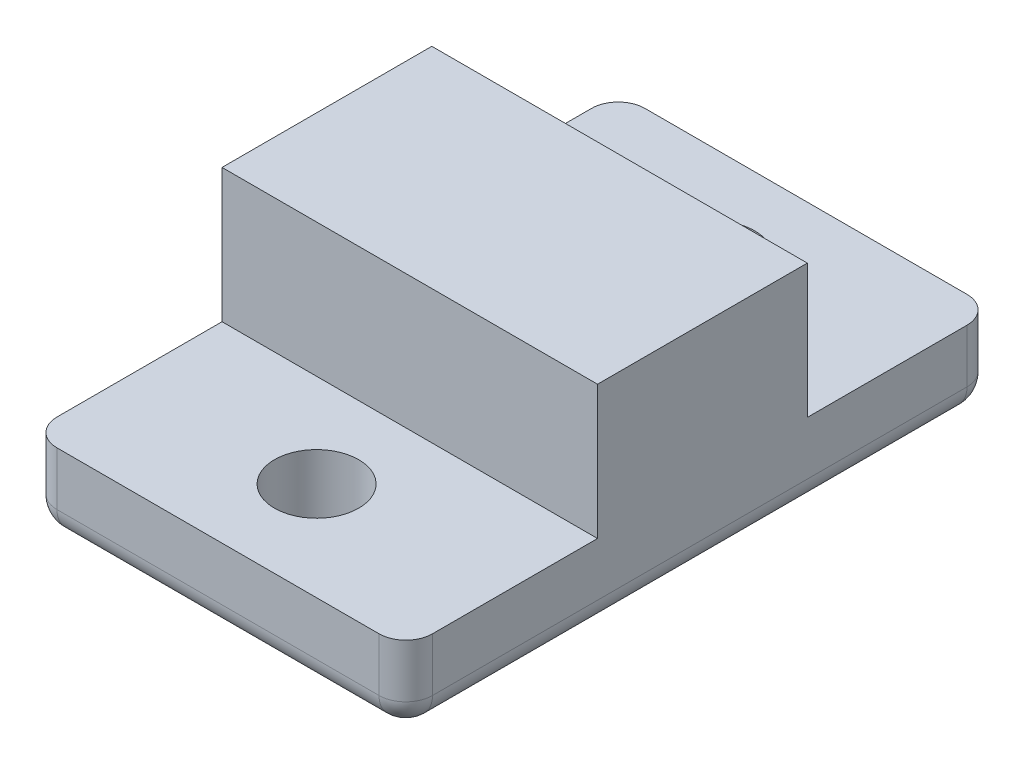
ISO-10303-21;
HEADER;
FILE_DESCRIPTION(('STEP AP214'),'2;1');
FILE_NAME('part.step','',(''),(''),'','','');
FILE_SCHEMA(('AUTOMOTIVE_DESIGN { 1 0 10303 214 1 1 1 1 }'));
ENDSEC;
DATA;
#1=APPLICATION_CONTEXT('core data for automotive mechanical design processes');
#2=APPLICATION_PROTOCOL_DEFINITION('international standard','automotive_design',2000,#1);
#3=PRODUCT_CONTEXT('',#1,'mechanical');
#4=PRODUCT('Part','Part','',(#3));
#5=PRODUCT_RELATED_PRODUCT_CATEGORY('part','',(#4));
#6=PRODUCT_DEFINITION_FORMATION('','',#4);
#7=PRODUCT_DEFINITION_CONTEXT('part definition',#1,'design');
#8=PRODUCT_DEFINITION('design','',#6,#7);
#9=PRODUCT_DEFINITION_SHAPE('','',#8);
#10=(LENGTH_UNIT() NAMED_UNIT(*) SI_UNIT(.MILLI.,.METRE.));
#11=(NAMED_UNIT(*) PLANE_ANGLE_UNIT() SI_UNIT($,.RADIAN.));
#12=(NAMED_UNIT(*) SI_UNIT($,.STERADIAN.) SOLID_ANGLE_UNIT());
#13=UNCERTAINTY_MEASURE_WITH_UNIT(LENGTH_MEASURE(1.E-05),#10,'distance_accuracy_value','');
#14=(GEOMETRIC_REPRESENTATION_CONTEXT(3) GLOBAL_UNCERTAINTY_ASSIGNED_CONTEXT((#13)) GLOBAL_UNIT_ASSIGNED_CONTEXT((#10,
#11,#12)) REPRESENTATION_CONTEXT('',''));
#15=CARTESIAN_POINT('',(0.,0.,0.));
#16=DIRECTION('',(0.,0.,1.));
#17=DIRECTION('',(1.,0.,0.));
#18=AXIS2_PLACEMENT_3D('',#15,#16,#17);
#19=CARTESIAN_POINT('',(7.025,5.,-3.925));
#20=DIRECTION('',(-1.,0.,0.));
#21=DIRECTION('',(0.,0.,1.));
#22=AXIS2_PLACEMENT_3D('',#19,#20,#21);
#23=PLANE('',#22);
#24=DIRECTION('',(0.,0.,1.));
#25=VECTOR('',#24,1.);
#26=CARTESIAN_POINT('',(7.025,0.,-3.925));
#27=LINE('',#26,#25);
#28=CARTESIAN_POINT('',(7.025,0.,3.925));
#29=VERTEX_POINT('',#28);
#30=CARTESIAN_POINT('',(7.025,0.,10.1));
#31=VERTEX_POINT('',#30);
#32=EDGE_CURVE('E147',#29,#31,#27,.T.);
#33=ORIENTED_EDGE('',*,*,#32,.T.);
#34=DIRECTION('',(0.,1.,0.));
#35=VECTOR('',#34,1.);
#36=CARTESIAN_POINT('',(7.025,5.,10.1));
#37=LINE('',#36,#35);
#38=CARTESIAN_POINT('',(7.025,-2.,10.1));
#39=VERTEX_POINT('',#38);
#40=EDGE_CURVE('E187',#31,#39,#37,.F.);
#41=ORIENTED_EDGE('',*,*,#40,.T.);
#42=DIRECTION('',(0.,0.,1.));
#43=VECTOR('',#42,1.);
#44=CARTESIAN_POINT('',(7.025,-2.,-10.9));
#45=LINE('',#44,#43);
#46=CARTESIAN_POINT('',(7.025,-2.,-9.9));
#47=VERTEX_POINT('',#46);
#48=EDGE_CURVE('E184',#39,#47,#45,.F.);
#49=ORIENTED_EDGE('',*,*,#48,.T.);
#50=DIRECTION('',(0.,1.,0.));
#51=VECTOR('',#50,1.);
#52=CARTESIAN_POINT('',(7.025,5.,-9.9));
#53=LINE('',#52,#51);
#54=CARTESIAN_POINT('',(7.025,0.,-9.9));
#55=VERTEX_POINT('',#54);
#56=EDGE_CURVE('E143',#47,#55,#53,.T.);
#57=ORIENTED_EDGE('',*,*,#56,.T.);
#58=CARTESIAN_POINT('',(7.025,0.,-3.925));
#59=VERTEX_POINT('',#58);
#60=EDGE_CURVE('E136',#55,#59,#27,.T.);
#61=ORIENTED_EDGE('',*,*,#60,.T.);
#62=DIRECTION('',(0.,-1.,0.));
#63=VECTOR('',#62,1.);
#64=CARTESIAN_POINT('',(7.025,5.,-3.925));
#65=LINE('',#64,#63);
#66=CARTESIAN_POINT('',(7.025,5.,-3.925));
#67=VERTEX_POINT('',#66);
#68=EDGE_CURVE('E141',#67,#59,#65,.T.);
#69=ORIENTED_EDGE('',*,*,#68,.F.);
#70=DIRECTION('',(0.,0.,-1.));
#71=VECTOR('',#70,1.);
#72=CARTESIAN_POINT('',(7.025,5.,-3.925));
#73=LINE('',#72,#71);
#74=CARTESIAN_POINT('',(7.025,5.,3.925));
#75=VERTEX_POINT('',#74);
#76=EDGE_CURVE('E263',#75,#67,#73,.T.);
#77=ORIENTED_EDGE('',*,*,#76,.F.);
#78=DIRECTION('',(0.,-1.,0.));
#79=VECTOR('',#78,1.);
#80=CARTESIAN_POINT('',(7.025,5.,3.925));
#81=LINE('',#80,#79);
#82=EDGE_CURVE('E269',#75,#29,#81,.T.);
#83=ORIENTED_EDGE('',*,*,#82,.T.);
#84=EDGE_LOOP('',(#33,#41,#49,#57,#61,#69,#77,#83));
#85=FACE_BOUND('',#84,.T.);
#86=ADVANCED_FACE('F35',(#85),#23,.F.);
#87=CARTESIAN_POINT('',(-7.025,5.,-3.925));
#88=DIRECTION('',(0.,0.,1.));
#89=DIRECTION('',(1.,0.,0.));
#90=AXIS2_PLACEMENT_3D('',#87,#88,#89);
#91=PLANE('',#90);
#92=DIRECTION('',(-1.,0.,0.));
#93=VECTOR('',#92,1.);
#94=CARTESIAN_POINT('',(-7.025,0.,-3.925));
#95=LINE('',#94,#93);
#96=CARTESIAN_POINT('',(-7.025,0.,-3.925));
#97=VERTEX_POINT('',#96);
#98=EDGE_CURVE('E146',#59,#97,#95,.T.);
#99=ORIENTED_EDGE('',*,*,#98,.T.);
#100=DIRECTION('',(0.,-1.,0.));
#101=VECTOR('',#100,1.);
#102=CARTESIAN_POINT('',(-7.025,5.,-3.925));
#103=LINE('',#102,#101);
#104=CARTESIAN_POINT('',(-7.025,5.,-3.925));
#105=VERTEX_POINT('',#104);
#106=EDGE_CURVE('E162',#105,#97,#103,.T.);
#107=ORIENTED_EDGE('',*,*,#106,.F.);
#108=DIRECTION('',(-1.,0.,0.));
#109=VECTOR('',#108,1.);
#110=CARTESIAN_POINT('',(-7.025,5.,-3.925));
#111=LINE('',#110,#109);
#112=EDGE_CURVE('E159',#67,#105,#111,.T.);
#113=ORIENTED_EDGE('',*,*,#112,.F.);
#114=ORIENTED_EDGE('',*,*,#68,.T.);
#115=EDGE_LOOP('',(#99,#107,#113,#114));
#116=FACE_BOUND('',#115,.T.);
#117=ADVANCED_FACE('F158',(#116),#91,.F.);
#118=CARTESIAN_POINT('',(-7.025,5.,-3.925));
#119=DIRECTION('',(1.,0.,0.));
#120=DIRECTION('',(0.,0.,-1.));
#121=AXIS2_PLACEMENT_3D('',#118,#119,#120);
#122=PLANE('',#121);
#123=DIRECTION('',(0.,0.,-1.));
#124=VECTOR('',#123,1.);
#125=CARTESIAN_POINT('',(-7.025,-2.,11.1));
#126=LINE('',#125,#124);
#127=CARTESIAN_POINT('',(-7.025,-2.,-9.9));
#128=VERTEX_POINT('',#127);
#129=CARTESIAN_POINT('',(-7.025,-2.,10.1));
#130=VERTEX_POINT('',#129);
#131=EDGE_CURVE('E161',#128,#130,#126,.F.);
#132=ORIENTED_EDGE('',*,*,#131,.T.);
#133=DIRECTION('',(0.,1.,0.));
#134=VECTOR('',#133,1.);
#135=CARTESIAN_POINT('',(-7.025,5.,10.1));
#136=LINE('',#135,#134);
#137=CARTESIAN_POINT('',(-7.025,0.,10.1));
#138=VERTEX_POINT('',#137);
#139=EDGE_CURVE('E171',#130,#138,#136,.T.);
#140=ORIENTED_EDGE('',*,*,#139,.T.);
#141=DIRECTION('',(0.,0.,-1.));
#142=VECTOR('',#141,1.);
#143=CARTESIAN_POINT('',(-7.025,0.,-3.925));
#144=LINE('',#143,#142);
#145=CARTESIAN_POINT('',(-7.025,0.,3.925));
#146=VERTEX_POINT('',#145);
#147=EDGE_CURVE('E258',#138,#146,#144,.T.);
#148=ORIENTED_EDGE('',*,*,#147,.T.);
#149=DIRECTION('',(0.,-1.,0.));
#150=VECTOR('',#149,1.);
#151=CARTESIAN_POINT('',(-7.025,5.,3.925));
#152=LINE('',#151,#150);
#153=CARTESIAN_POINT('',(-7.025,5.,3.925));
#154=VERTEX_POINT('',#153);
#155=EDGE_CURVE('E166',#154,#146,#152,.T.);
#156=ORIENTED_EDGE('',*,*,#155,.F.);
#157=DIRECTION('',(0.,0.,1.));
#158=VECTOR('',#157,1.);
#159=CARTESIAN_POINT('',(-7.025,5.,-3.925));
#160=LINE('',#159,#158);
#161=EDGE_CURVE('E266',#105,#154,#160,.T.);
#162=ORIENTED_EDGE('',*,*,#161,.F.);
#163=ORIENTED_EDGE('',*,*,#106,.T.);
#164=CARTESIAN_POINT('',(-7.025,0.,-9.9));
#165=VERTEX_POINT('',#164);
#166=EDGE_CURVE('E152',#97,#165,#144,.T.);
#167=ORIENTED_EDGE('',*,*,#166,.T.);
#168=DIRECTION('',(0.,1.,0.));
#169=VECTOR('',#168,1.);
#170=CARTESIAN_POINT('',(-7.025,5.,-9.9));
#171=LINE('',#170,#169);
#172=EDGE_CURVE('E164',#165,#128,#171,.F.);
#173=ORIENTED_EDGE('',*,*,#172,.T.);
#174=EDGE_LOOP('',(#132,#140,#148,#156,#162,#163,#167,#173));
#175=FACE_BOUND('',#174,.T.);
#176=ADVANCED_FACE('F283',(#175),#122,.F.);
#177=CARTESIAN_POINT('',(-7.025,5.,3.925));
#178=DIRECTION('',(0.,0.,-1.));
#179=DIRECTION('',(-1.,0.,0.));
#180=AXIS2_PLACEMENT_3D('',#177,#178,#179);
#181=PLANE('',#180);
#182=DIRECTION('',(1.,0.,0.));
#183=VECTOR('',#182,1.);
#184=CARTESIAN_POINT('',(-7.025,0.,3.925));
#185=LINE('',#184,#183);
#186=EDGE_CURVE('E156',#146,#29,#185,.T.);
#187=ORIENTED_EDGE('',*,*,#186,.T.);
#188=ORIENTED_EDGE('',*,*,#82,.F.);
#189=DIRECTION('',(1.,0.,0.));
#190=VECTOR('',#189,1.);
#191=CARTESIAN_POINT('',(-7.025,5.,3.925));
#192=LINE('',#191,#190);
#193=EDGE_CURVE('E268',#154,#75,#192,.T.);
#194=ORIENTED_EDGE('',*,*,#193,.F.);
#195=ORIENTED_EDGE('',*,*,#155,.T.);
#196=EDGE_LOOP('',(#187,#188,#194,#195));
#197=FACE_BOUND('',#196,.T.);
#198=ADVANCED_FACE('F278',(#197),#181,.F.);
#199=CARTESIAN_POINT('',(0.,5.,0.));
#200=DIRECTION('',(0.,1.,0.));
#201=DIRECTION('',(0.,0.,1.));
#202=AXIS2_PLACEMENT_3D('',#199,#200,#201);
#203=PLANE('',#202);
#204=ORIENTED_EDGE('',*,*,#76,.T.);
#205=ORIENTED_EDGE('',*,*,#112,.T.);
#206=ORIENTED_EDGE('',*,*,#161,.T.);
#207=ORIENTED_EDGE('',*,*,#193,.T.);
#208=EDGE_LOOP('',(#204,#205,#206,#207));
#209=FACE_BOUND('',#208,.T.);
#210=ADVANCED_FACE('F483',(#209),#203,.T.);
#211=CARTESIAN_POINT('',(0.,0.,0.));
#212=DIRECTION('',(0.,-1.,0.));
#213=DIRECTION('',(0.,0.,-1.));
#214=AXIS2_PLACEMENT_3D('',#211,#212,#213);
#215=PLANE('',#214);
#216=CARTESIAN_POINT('',(0.,0.,7.4125));
#217=DIRECTION('',(0.,-1.,0.));
#218=DIRECTION('',(0.,0.,-1.));
#219=AXIS2_PLACEMENT_3D('',#216,#217,#218);
#220=CIRCLE('',#219,1.575);
#221=CARTESIAN_POINT('',(0.,0.,5.8375));
#222=VERTEX_POINT('',#221);
#223=EDGE_CURVE('E237',#222,#222,#220,.T.);
#224=ORIENTED_EDGE('',*,*,#223,.T.);
#225=EDGE_LOOP('',(#224));
#226=FACE_BOUND('',#225,.T.);
#227=ORIENTED_EDGE('',*,*,#147,.F.);
#228=CARTESIAN_POINT('',(-6.025,0.,10.1));
#229=DIRECTION('',(0.,-1.,0.));
#230=DIRECTION('',(0.,0.,-1.));
#231=AXIS2_PLACEMENT_3D('',#228,#229,#230);
#232=CIRCLE('',#231,1.);
#233=CARTESIAN_POINT('',(-6.025,0.,11.1));
#234=VERTEX_POINT('',#233);
#235=EDGE_CURVE('E176',#138,#234,#232,.F.);
#236=ORIENTED_EDGE('',*,*,#235,.T.);
#237=DIRECTION('',(-1.,0.,0.));
#238=VECTOR('',#237,1.);
#239=CARTESIAN_POINT('',(7.025,0.,11.1));
#240=LINE('',#239,#238);
#241=CARTESIAN_POINT('',(6.025,0.,11.1));
#242=VERTEX_POINT('',#241);
#243=EDGE_CURVE('E253',#242,#234,#240,.T.);
#244=ORIENTED_EDGE('',*,*,#243,.F.);
#245=CARTESIAN_POINT('',(6.025,0.,10.1));
#246=DIRECTION('',(0.,-1.,0.));
#247=DIRECTION('',(0.,0.,-1.));
#248=AXIS2_PLACEMENT_3D('',#245,#246,#247);
#249=CIRCLE('',#248,1.);
#250=EDGE_CURVE('E174',#242,#31,#249,.F.);
#251=ORIENTED_EDGE('',*,*,#250,.T.);
#252=ORIENTED_EDGE('',*,*,#32,.F.);
#253=ORIENTED_EDGE('',*,*,#186,.F.);
#254=EDGE_LOOP('',(#227,#236,#244,#251,#252,#253));
#255=FACE_BOUND('',#254,.T.);
#256=ADVANCED_FACE('F287',(#226,#255),#215,.F.);
#257=CARTESIAN_POINT('',(7.025,-3.,11.1));
#258=DIRECTION('',(0.,0.,-1.));
#259=DIRECTION('',(-1.,0.,0.));
#260=AXIS2_PLACEMENT_3D('',#257,#258,#259);
#261=PLANE('',#260);
#262=ORIENTED_EDGE('',*,*,#243,.T.);
#263=DIRECTION('',(0.,1.,0.));
#264=VECTOR('',#263,1.);
#265=CARTESIAN_POINT('',(-6.025,-3.,11.1));
#266=LINE('',#265,#264);
#267=CARTESIAN_POINT('',(-6.025,-2.,11.1));
#268=VERTEX_POINT('',#267);
#269=EDGE_CURVE('E182',#234,#268,#266,.F.);
#270=ORIENTED_EDGE('',*,*,#269,.T.);
#271=DIRECTION('',(-1.,0.,0.));
#272=VECTOR('',#271,1.);
#273=CARTESIAN_POINT('',(7.025,-2.,11.1));
#274=LINE('',#273,#272);
#275=CARTESIAN_POINT('',(6.025,-2.,11.1));
#276=VERTEX_POINT('',#275);
#277=EDGE_CURVE('E178',#268,#276,#274,.F.);
#278=ORIENTED_EDGE('',*,*,#277,.T.);
#279=DIRECTION('',(0.,1.,0.));
#280=VECTOR('',#279,1.);
#281=CARTESIAN_POINT('',(6.025,-3.,11.1));
#282=LINE('',#281,#280);
#283=EDGE_CURVE('E180',#276,#242,#282,.T.);
#284=ORIENTED_EDGE('',*,*,#283,.T.);
#285=EDGE_LOOP('',(#262,#270,#278,#284));
#286=FACE_BOUND('',#285,.T.);
#287=ADVANCED_FACE('F330',(#286),#261,.F.);
#288=CARTESIAN_POINT('',(-7.025,-3.,-10.9));
#289=DIRECTION('',(0.,0.,1.));
#290=DIRECTION('',(1.,0.,0.));
#291=AXIS2_PLACEMENT_3D('',#288,#289,#290);
#292=PLANE('',#291);
#293=DIRECTION('',(1.,0.,0.));
#294=VECTOR('',#293,1.);
#295=CARTESIAN_POINT('',(-7.025,0.,-10.9));
#296=LINE('',#295,#294);
#297=CARTESIAN_POINT('',(-6.025,0.,-10.9));
#298=VERTEX_POINT('',#297);
#299=CARTESIAN_POINT('',(6.025,0.,-10.9));
#300=VERTEX_POINT('',#299);
#301=EDGE_CURVE('E260',#298,#300,#296,.T.);
#302=ORIENTED_EDGE('',*,*,#301,.T.);
#303=DIRECTION('',(0.,1.,0.));
#304=VECTOR('',#303,1.);
#305=CARTESIAN_POINT('',(6.025,-3.,-10.9));
#306=LINE('',#305,#304);
#307=CARTESIAN_POINT('',(6.025,-2.,-10.9));
#308=VERTEX_POINT('',#307);
#309=EDGE_CURVE('E197',#300,#308,#306,.F.);
#310=ORIENTED_EDGE('',*,*,#309,.T.);
#311=DIRECTION('',(1.,0.,0.));
#312=VECTOR('',#311,1.);
#313=CARTESIAN_POINT('',(-7.025,-2.,-10.9));
#314=LINE('',#313,#312);
#315=CARTESIAN_POINT('',(-6.025,-2.,-10.9));
#316=VERTEX_POINT('',#315);
#317=EDGE_CURVE('E193',#308,#316,#314,.F.);
#318=ORIENTED_EDGE('',*,*,#317,.T.);
#319=DIRECTION('',(0.,1.,0.));
#320=VECTOR('',#319,1.);
#321=CARTESIAN_POINT('',(-6.025,-3.,-10.9));
#322=LINE('',#321,#320);
#323=EDGE_CURVE('E195',#316,#298,#322,.T.);
#324=ORIENTED_EDGE('',*,*,#323,.T.);
#325=EDGE_LOOP('',(#302,#310,#318,#324));
#326=FACE_BOUND('',#325,.T.);
#327=ADVANCED_FACE('F304',(#326),#292,.F.);
#328=CARTESIAN_POINT('',(0.,-3.,0.));
#329=DIRECTION('',(0.,-1.,0.));
#330=DIRECTION('',(0.,0.,-1.));
#331=AXIS2_PLACEMENT_3D('',#328,#329,#330);
#332=PLANE('',#331);
#333=DIRECTION('',(-1.,0.,0.));
#334=VECTOR('',#333,1.);
#335=CARTESIAN_POINT('',(-7.025,-3.,10.1));
#336=LINE('',#335,#334);
#337=CARTESIAN_POINT('',(6.025,-3.,10.1));
#338=VERTEX_POINT('',#337);
#339=CARTESIAN_POINT('',(-6.025,-3.,10.1));
#340=VERTEX_POINT('',#339);
#341=EDGE_CURVE('E44',#338,#340,#336,.T.);
#342=ORIENTED_EDGE('',*,*,#341,.T.);
#343=DIRECTION('',(0.,0.,-1.));
#344=VECTOR('',#343,1.);
#345=CARTESIAN_POINT('',(-6.025,-3.,-10.9));
#346=LINE('',#345,#344);
#347=CARTESIAN_POINT('',(-6.025,-3.,-9.9));
#348=VERTEX_POINT('',#347);
#349=EDGE_CURVE('E11',#340,#348,#346,.T.);
#350=ORIENTED_EDGE('',*,*,#349,.T.);
#351=DIRECTION('',(1.,0.,0.));
#352=VECTOR('',#351,1.);
#353=CARTESIAN_POINT('',(7.025,-3.,-9.9));
#354=LINE('',#353,#352);
#355=CARTESIAN_POINT('',(6.025,-3.,-9.9));
#356=VERTEX_POINT('',#355);
#357=EDGE_CURVE('E199',#348,#356,#354,.T.);
#358=ORIENTED_EDGE('',*,*,#357,.T.);
#359=DIRECTION('',(0.,0.,1.));
#360=VECTOR('',#359,1.);
#361=CARTESIAN_POINT('',(6.025,-3.,11.1));
#362=LINE('',#361,#360);
#363=EDGE_CURVE('E55',#356,#338,#362,.T.);
#364=ORIENTED_EDGE('',*,*,#363,.T.);
#365=EDGE_LOOP('',(#342,#350,#358,#364));
#366=FACE_BOUND('',#365,.T.);
#367=CARTESIAN_POINT('',(0.,-3.,7.4125));
#368=DIRECTION('',(0.,-1.,0.));
#369=DIRECTION('',(0.,0.,-1.));
#370=AXIS2_PLACEMENT_3D('',#367,#368,#369);
#371=CIRCLE('',#370,1.575);
#372=CARTESIAN_POINT('',(0.,-3.,5.8375));
#373=VERTEX_POINT('',#372);
#374=EDGE_CURVE('E242',#373,#373,#371,.T.);
#375=ORIENTED_EDGE('',*,*,#374,.F.);
#376=EDGE_LOOP('',(#375));
#377=FACE_BOUND('',#376,.T.);
#378=CARTESIAN_POINT('',(0.,-3.,-7.4125));
#379=DIRECTION('',(0.,1.,0.));
#380=DIRECTION('',(0.,0.,1.));
#381=AXIS2_PLACEMENT_3D('',#378,#379,#380);
#382=CIRCLE('',#381,1.575);
#383=CARTESIAN_POINT('',(0.,-3.,-5.8375));
#384=VERTEX_POINT('',#383);
#385=EDGE_CURVE('E250',#384,#384,#382,.T.);
#386=ORIENTED_EDGE('',*,*,#385,.T.);
#387=EDGE_LOOP('',(#386));
#388=FACE_BOUND('',#387,.T.);
#389=ADVANCED_FACE('F453',(#366,#377,#388),#332,.T.);
#390=CARTESIAN_POINT('',(0.,0.,-7.4125));
#391=DIRECTION('',(0.,1.,0.));
#392=DIRECTION('',(0.,0.,1.));
#393=AXIS2_PLACEMENT_3D('',#390,#391,#392);
#394=CIRCLE('',#393,1.575);
#395=CARTESIAN_POINT('',(0.,0.,-5.8375));
#396=VERTEX_POINT('',#395);
#397=EDGE_CURVE('E247',#396,#396,#394,.T.);
#398=ORIENTED_EDGE('',*,*,#397,.F.);
#399=EDGE_LOOP('',(#398));
#400=FACE_BOUND('',#399,.T.);
#401=ORIENTED_EDGE('',*,*,#60,.F.);
#402=CARTESIAN_POINT('',(6.025,0.,-9.9));
#403=DIRECTION('',(0.,-1.,0.));
#404=DIRECTION('',(0.,0.,-1.));
#405=AXIS2_PLACEMENT_3D('',#402,#403,#404);
#406=CIRCLE('',#405,1.);
#407=EDGE_CURVE('E191',#55,#300,#406,.F.);
#408=ORIENTED_EDGE('',*,*,#407,.T.);
#409=ORIENTED_EDGE('',*,*,#301,.F.);
#410=CARTESIAN_POINT('',(-6.025,0.,-9.9));
#411=DIRECTION('',(0.,-1.,0.));
#412=DIRECTION('',(0.,0.,-1.));
#413=AXIS2_PLACEMENT_3D('',#410,#411,#412);
#414=CIRCLE('',#413,1.);
#415=EDGE_CURVE('E189',#298,#165,#414,.F.);
#416=ORIENTED_EDGE('',*,*,#415,.T.);
#417=ORIENTED_EDGE('',*,*,#166,.F.);
#418=ORIENTED_EDGE('',*,*,#98,.F.);
#419=EDGE_LOOP('',(#401,#408,#409,#416,#417,#418));
#420=FACE_BOUND('',#419,.T.);
#421=ADVANCED_FACE('F150',(#400,#420),#215,.F.);
#422=CARTESIAN_POINT('',(0.,-3.,-7.4125));
#423=DIRECTION('',(0.,1.,0.));
#424=DIRECTION('',(0.,0.,1.));
#425=AXIS2_PLACEMENT_3D('',#422,#423,#424);
#426=CYLINDRICAL_SURFACE('',#425,1.575);
#427=ORIENTED_EDGE('',*,*,#385,.F.);
#428=EDGE_LOOP('',(#427));
#429=FACE_BOUND('',#428,.T.);
#430=ORIENTED_EDGE('',*,*,#397,.T.);
#431=EDGE_LOOP('',(#430));
#432=FACE_BOUND('',#431,.T.);
#433=ADVANCED_FACE('F436',(#429,#432),#426,.F.);
#434=CARTESIAN_POINT('',(0.,-3.,7.4125));
#435=DIRECTION('',(0.,1.,0.));
#436=DIRECTION('',(0.,0.,1.));
#437=AXIS2_PLACEMENT_3D('',#434,#435,#436);
#438=CYLINDRICAL_SURFACE('',#437,1.575);
#439=ORIENTED_EDGE('',*,*,#374,.T.);
#440=EDGE_LOOP('',(#439));
#441=FACE_BOUND('',#440,.T.);
#442=ORIENTED_EDGE('',*,*,#223,.F.);
#443=EDGE_LOOP('',(#442));
#444=FACE_BOUND('',#443,.T.);
#445=ADVANCED_FACE('F428',(#441,#444),#438,.F.);
#446=CARTESIAN_POINT('',(6.025,5.,-9.9));
#447=DIRECTION('',(0.,1.,0.));
#448=DIRECTION('',(0.,0.,1.));
#449=AXIS2_PLACEMENT_3D('',#446,#447,#448);
#450=CYLINDRICAL_SURFACE('',#449,1.);
#451=CARTESIAN_POINT('',(6.025,-2.,-9.9));
#452=DIRECTION('',(0.,-1.,0.));
#453=DIRECTION('',(0.,0.,-1.));
#454=AXIS2_PLACEMENT_3D('',#451,#452,#453);
#455=CIRCLE('',#454,1.);
#456=EDGE_CURVE('E39',#308,#47,#455,.T.);
#457=ORIENTED_EDGE('',*,*,#456,.F.);
#458=ORIENTED_EDGE('',*,*,#309,.F.);
#459=ORIENTED_EDGE('',*,*,#407,.F.);
#460=ORIENTED_EDGE('',*,*,#56,.F.);
#461=EDGE_LOOP('',(#457,#458,#459,#460));
#462=FACE_BOUND('',#461,.T.);
#463=ADVANCED_FACE('F37',(#462),#450,.T.);
#464=CARTESIAN_POINT('',(6.025,-2.,-9.9));
#465=DIRECTION('',(0.,0.,1.));
#466=DIRECTION('',(1.,0.,0.));
#467=AXIS2_PLACEMENT_3D('',#464,#465,#466);
#468=SPHERICAL_SURFACE('',#467,1.);
#469=CARTESIAN_POINT('',(6.025,-2.,-9.9));
#470=DIRECTION('',(1.,0.,0.));
#471=DIRECTION('',(0.,0.,-1.));
#472=AXIS2_PLACEMENT_3D('',#469,#470,#471);
#473=CIRCLE('',#472,1.);
#474=EDGE_CURVE('E229',#308,#356,#473,.F.);
#475=ORIENTED_EDGE('',*,*,#474,.F.);
#476=ORIENTED_EDGE('',*,*,#456,.T.);
#477=CARTESIAN_POINT('',(6.025,-2.,-9.9));
#478=DIRECTION('',(0.,0.,-1.));
#479=DIRECTION('',(-1.,0.,0.));
#480=AXIS2_PLACEMENT_3D('',#477,#478,#479);
#481=CIRCLE('',#480,1.);
#482=EDGE_CURVE('E231',#356,#47,#481,.F.);
#483=ORIENTED_EDGE('',*,*,#482,.F.);
#484=EDGE_LOOP('',(#475,#476,#483));
#485=FACE_BOUND('',#484,.T.);
#486=ADVANCED_FACE('F414',(#485),#468,.T.);
#487=CARTESIAN_POINT('',(6.025,-3.,10.1));
#488=DIRECTION('',(0.,1.,0.));
#489=DIRECTION('',(0.,0.,1.));
#490=AXIS2_PLACEMENT_3D('',#487,#488,#489);
#491=CYLINDRICAL_SURFACE('',#490,1.);
#492=ORIENTED_EDGE('',*,*,#250,.F.);
#493=ORIENTED_EDGE('',*,*,#283,.F.);
#494=CARTESIAN_POINT('',(6.025,-2.,10.1));
#495=DIRECTION('',(0.,-1.,0.));
#496=DIRECTION('',(0.,0.,-1.));
#497=AXIS2_PLACEMENT_3D('',#494,#495,#496);
#498=CIRCLE('',#497,1.);
#499=EDGE_CURVE('E226',#39,#276,#498,.T.);
#500=ORIENTED_EDGE('',*,*,#499,.F.);
#501=ORIENTED_EDGE('',*,*,#40,.F.);
#502=EDGE_LOOP('',(#492,#493,#500,#501));
#503=FACE_BOUND('',#502,.T.);
#504=ADVANCED_FACE('F293',(#503),#491,.T.);
#505=CARTESIAN_POINT('',(6.025,-2.,0.));
#506=DIRECTION('',(0.,0.,-1.));
#507=DIRECTION('',(-1.,0.,0.));
#508=AXIS2_PLACEMENT_3D('',#505,#506,#507);
#509=CYLINDRICAL_SURFACE('',#508,1.);
#510=ORIENTED_EDGE('',*,*,#482,.T.);
#511=ORIENTED_EDGE('',*,*,#48,.F.);
#512=CARTESIAN_POINT('',(6.025,-2.,10.1));
#513=DIRECTION('',(0.,0.,1.));
#514=DIRECTION('',(1.,0.,0.));
#515=AXIS2_PLACEMENT_3D('',#512,#513,#514);
#516=CIRCLE('',#515,1.);
#517=EDGE_CURVE('E223',#338,#39,#516,.T.);
#518=ORIENTED_EDGE('',*,*,#517,.F.);
#519=ORIENTED_EDGE('',*,*,#363,.F.);
#520=EDGE_LOOP('',(#510,#511,#518,#519));
#521=FACE_BOUND('',#520,.T.);
#522=ADVANCED_FACE('F298',(#521),#509,.T.);
#523=CARTESIAN_POINT('',(0.,-2.,-9.9));
#524=DIRECTION('',(-1.,0.,0.));
#525=DIRECTION('',(0.,0.,1.));
#526=AXIS2_PLACEMENT_3D('',#523,#524,#525);
#527=CYLINDRICAL_SURFACE('',#526,1.);
#528=ORIENTED_EDGE('',*,*,#474,.T.);
#529=ORIENTED_EDGE('',*,*,#357,.F.);
#530=CARTESIAN_POINT('',(-6.025,-2.,-9.9));
#531=DIRECTION('',(-1.,0.,0.));
#532=DIRECTION('',(0.,-1.,0.));
#533=AXIS2_PLACEMENT_3D('',#530,#531,#532);
#534=CIRCLE('',#533,1.);
#535=EDGE_CURVE('E220',#316,#348,#534,.T.);
#536=ORIENTED_EDGE('',*,*,#535,.F.);
#537=ORIENTED_EDGE('',*,*,#317,.F.);
#538=EDGE_LOOP('',(#528,#529,#536,#537));
#539=FACE_BOUND('',#538,.T.);
#540=ADVANCED_FACE('F315',(#539),#527,.T.);
#541=CARTESIAN_POINT('',(-6.025,-3.,-9.9));
#542=DIRECTION('',(0.,1.,0.));
#543=DIRECTION('',(0.,0.,1.));
#544=AXIS2_PLACEMENT_3D('',#541,#542,#543);
#545=CYLINDRICAL_SURFACE('',#544,1.);
#546=ORIENTED_EDGE('',*,*,#415,.F.);
#547=ORIENTED_EDGE('',*,*,#323,.F.);
#548=CARTESIAN_POINT('',(-6.025,-2.,-9.9));
#549=DIRECTION('',(0.,-1.,0.));
#550=DIRECTION('',(0.,0.,-1.));
#551=AXIS2_PLACEMENT_3D('',#548,#549,#550);
#552=CIRCLE('',#551,1.);
#553=EDGE_CURVE('E217',#128,#316,#552,.T.);
#554=ORIENTED_EDGE('',*,*,#553,.F.);
#555=ORIENTED_EDGE('',*,*,#172,.F.);
#556=EDGE_LOOP('',(#546,#547,#554,#555));
#557=FACE_BOUND('',#556,.T.);
#558=ADVANCED_FACE('F310',(#557),#545,.T.);
#559=CARTESIAN_POINT('',(6.025,-2.,10.1));
#560=DIRECTION('',(0.,0.,1.));
#561=DIRECTION('',(1.,0.,0.));
#562=AXIS2_PLACEMENT_3D('',#559,#560,#561);
#563=SPHERICAL_SURFACE('',#562,1.);
#564=ORIENTED_EDGE('',*,*,#517,.T.);
#565=ORIENTED_EDGE('',*,*,#499,.T.);
#566=CARTESIAN_POINT('',(6.025,-2.,10.1));
#567=DIRECTION('',(1.,0.,0.));
#568=DIRECTION('',(0.,0.,-1.));
#569=AXIS2_PLACEMENT_3D('',#566,#567,#568);
#570=CIRCLE('',#569,1.);
#571=EDGE_CURVE('E214',#338,#276,#570,.F.);
#572=ORIENTED_EDGE('',*,*,#571,.F.);
#573=EDGE_LOOP('',(#564,#565,#572));
#574=FACE_BOUND('',#573,.T.);
#575=ADVANCED_FACE('F297',(#574),#563,.T.);
#576=CARTESIAN_POINT('',(-6.025,-2.,-9.9));
#577=DIRECTION('',(0.,0.,1.));
#578=DIRECTION('',(1.,0.,0.));
#579=AXIS2_PLACEMENT_3D('',#576,#577,#578);
#580=SPHERICAL_SURFACE('',#579,1.);
#581=ORIENTED_EDGE('',*,*,#553,.T.);
#582=ORIENTED_EDGE('',*,*,#535,.T.);
#583=CARTESIAN_POINT('',(-6.025,-2.,-9.9));
#584=DIRECTION('',(0.,0.,-1.));
#585=DIRECTION('',(-1.,0.,0.));
#586=AXIS2_PLACEMENT_3D('',#583,#584,#585);
#587=CIRCLE('',#586,1.);
#588=EDGE_CURVE('E212',#128,#348,#587,.F.);
#589=ORIENTED_EDGE('',*,*,#588,.F.);
#590=EDGE_LOOP('',(#581,#582,#589));
#591=FACE_BOUND('',#590,.T.);
#592=ADVANCED_FACE('F317',(#591),#580,.T.);
#593=CARTESIAN_POINT('',(0.,-2.,10.1));
#594=DIRECTION('',(1.,0.,0.));
#595=DIRECTION('',(0.,0.,-1.));
#596=AXIS2_PLACEMENT_3D('',#593,#594,#595);
#597=CYLINDRICAL_SURFACE('',#596,1.);
#598=ORIENTED_EDGE('',*,*,#571,.T.);
#599=ORIENTED_EDGE('',*,*,#277,.F.);
#600=CARTESIAN_POINT('',(-6.025,-2.,10.1));
#601=DIRECTION('',(-1.,0.,0.));
#602=DIRECTION('',(0.,0.,1.));
#603=AXIS2_PLACEMENT_3D('',#600,#601,#602);
#604=CIRCLE('',#603,1.);
#605=EDGE_CURVE('E209',#340,#268,#604,.T.);
#606=ORIENTED_EDGE('',*,*,#605,.F.);
#607=ORIENTED_EDGE('',*,*,#341,.F.);
#608=EDGE_LOOP('',(#598,#599,#606,#607));
#609=FACE_BOUND('',#608,.T.);
#610=ADVANCED_FACE('F333',(#609),#597,.T.);
#611=CARTESIAN_POINT('',(-6.025,-2.,0.));
#612=DIRECTION('',(0.,0.,1.));
#613=DIRECTION('',(1.,0.,0.));
#614=AXIS2_PLACEMENT_3D('',#611,#612,#613);
#615=CYLINDRICAL_SURFACE('',#614,1.);
#616=ORIENTED_EDGE('',*,*,#588,.T.);
#617=ORIENTED_EDGE('',*,*,#349,.F.);
#618=CARTESIAN_POINT('',(-6.025,-2.,10.1));
#619=DIRECTION('',(0.,0.,1.));
#620=DIRECTION('',(1.,0.,0.));
#621=AXIS2_PLACEMENT_3D('',#618,#619,#620);
#622=CIRCLE('',#621,1.);
#623=EDGE_CURVE('E206',#130,#340,#622,.T.);
#624=ORIENTED_EDGE('',*,*,#623,.F.);
#625=ORIENTED_EDGE('',*,*,#131,.F.);
#626=EDGE_LOOP('',(#616,#617,#624,#625));
#627=FACE_BOUND('',#626,.T.);
#628=ADVANCED_FACE('F321',(#627),#615,.T.);
#629=CARTESIAN_POINT('',(-6.025,-2.,10.1));
#630=DIRECTION('',(0.,0.,1.));
#631=DIRECTION('',(1.,0.,0.));
#632=AXIS2_PLACEMENT_3D('',#629,#630,#631);
#633=SPHERICAL_SURFACE('',#632,1.);
#634=ORIENTED_EDGE('',*,*,#623,.T.);
#635=ORIENTED_EDGE('',*,*,#605,.T.);
#636=CARTESIAN_POINT('',(-6.025,-2.,10.1));
#637=DIRECTION('',(0.,-1.,0.));
#638=DIRECTION('',(0.,0.,-1.));
#639=AXIS2_PLACEMENT_3D('',#636,#637,#638);
#640=CIRCLE('',#639,1.);
#641=EDGE_CURVE('E203',#130,#268,#640,.F.);
#642=ORIENTED_EDGE('',*,*,#641,.F.);
#643=EDGE_LOOP('',(#634,#635,#642));
#644=FACE_BOUND('',#643,.T.);
#645=ADVANCED_FACE('F325',(#644),#633,.T.);
#646=CARTESIAN_POINT('',(-6.025,5.,10.1));
#647=DIRECTION('',(0.,1.,0.));
#648=DIRECTION('',(0.,0.,1.));
#649=AXIS2_PLACEMENT_3D('',#646,#647,#648);
#650=CYLINDRICAL_SURFACE('',#649,1.);
#651=ORIENTED_EDGE('',*,*,#641,.T.);
#652=ORIENTED_EDGE('',*,*,#269,.F.);
#653=ORIENTED_EDGE('',*,*,#235,.F.);
#654=ORIENTED_EDGE('',*,*,#139,.F.);
#655=EDGE_LOOP('',(#651,#652,#653,#654));
#656=FACE_BOUND('',#655,.T.);
#657=ADVANCED_FACE('F328',(#656),#650,.T.);
#658=CLOSED_SHELL('',(#86,#117,#176,#198,#210,#256,#287,#327,#389,#421,#433,#445,#463,#486,#504,
#522,#540,#558,#575,#592,#610,#628,#645,#657));
#659=MANIFOLD_SOLID_BREP('B2',#658);
#660=ADVANCED_BREP_SHAPE_REPRESENTATION('',(#18,#659),#14);
#661=SHAPE_DEFINITION_REPRESENTATION(#9,#660);
ENDSEC;
END-ISO-10303-21;
